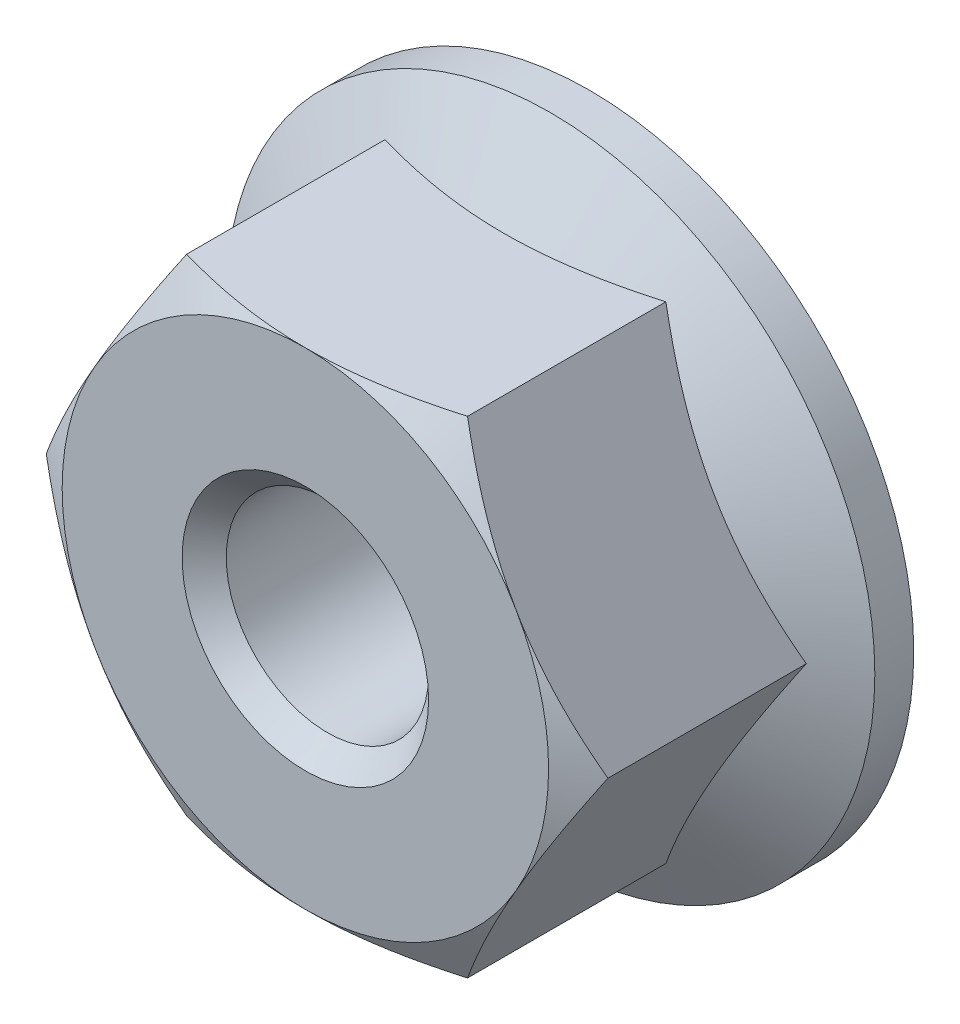
ISO-10303-21;
HEADER;
FILE_DESCRIPTION(('STEP AP214'),'2;1');
FILE_NAME('part.step','',(''),(''),'','','');
FILE_SCHEMA(('AUTOMOTIVE_DESIGN { 1 0 10303 214 1 1 1 1 }'));
ENDSEC;
DATA;
#1=APPLICATION_CONTEXT('core data for automotive mechanical design processes');
#2=APPLICATION_PROTOCOL_DEFINITION('international standard','automotive_design',2000,#1);
#3=PRODUCT_CONTEXT('',#1,'mechanical');
#4=PRODUCT('Part','Part','',(#3));
#5=PRODUCT_RELATED_PRODUCT_CATEGORY('part','',(#4));
#6=PRODUCT_DEFINITION_FORMATION('','',#4);
#7=PRODUCT_DEFINITION_CONTEXT('part definition',#1,'design');
#8=PRODUCT_DEFINITION('design','',#6,#7);
#9=PRODUCT_DEFINITION_SHAPE('','',#8);
#10=(LENGTH_UNIT() NAMED_UNIT(*) SI_UNIT(.MILLI.,.METRE.));
#11=(NAMED_UNIT(*) PLANE_ANGLE_UNIT() SI_UNIT($,.RADIAN.));
#12=(NAMED_UNIT(*) SI_UNIT($,.STERADIAN.) SOLID_ANGLE_UNIT());
#13=UNCERTAINTY_MEASURE_WITH_UNIT(LENGTH_MEASURE(1.E-05),#10,'distance_accuracy_value','');
#14=(GEOMETRIC_REPRESENTATION_CONTEXT(3) GLOBAL_UNCERTAINTY_ASSIGNED_CONTEXT((#13)) GLOBAL_UNIT_ASSIGNED_CONTEXT((#10,
#11,#12)) REPRESENTATION_CONTEXT('',''));
#15=CARTESIAN_POINT('',(0.,0.,0.));
#16=DIRECTION('',(0.,0.,1.));
#17=DIRECTION('',(1.,0.,0.));
#18=AXIS2_PLACEMENT_3D('',#15,#16,#17);
#19=CARTESIAN_POINT('',(0.,-4.7625,2.7813));
#20=DIRECTION('',(0.,-1.,0.));
#21=DIRECTION('',(0.,0.,-1.));
#22=AXIS2_PLACEMENT_3D('',#19,#20,#21);
#23=PLANE('',#22);
#24=CARTESIAN_POINT('',(-7.31277262481936,-4.7625,-3.39157957834396));
#25=CARTESIAN_POINT('',(-7.10531582893099,-4.7625,-3.29124059245172));
#26=CARTESIAN_POINT('',(-6.89737475905254,-4.7625,-3.19188530268858));
#27=CARTESIAN_POINT('',(-6.48026614732744,-4.7625,-2.9956970771459));
#28=CARTESIAN_POINT('',(-6.2710984113863,-4.7625,-2.89886455449802));
#29=CARTESIAN_POINT('',(-5.85016583326426,-4.7625,-2.70777413172438));
#30=CARTESIAN_POINT('',(-5.63839300109952,-4.7625,-2.61353376958497));
#31=CARTESIAN_POINT('',(-5.21313655356649,-4.7625,-2.42901032647706));
#32=CARTESIAN_POINT('',(-4.99965302198488,-4.7625,-2.33872705308252));
#33=CARTESIAN_POINT('',(-4.56413450975696,-4.7625,-2.16050502604635));
#34=CARTESIAN_POINT('',(-4.34203628404423,-4.7625,-2.07271996178041));
#35=CARTESIAN_POINT('',(-3.8952148687339,-4.7625,-1.90397249451181));
#36=CARTESIAN_POINT('',(-3.67049138415502,-4.7625,-1.82301086677019));
#37=CARTESIAN_POINT('',(-3.21850637128993,-4.7625,-1.6700886554335));
#38=CARTESIAN_POINT('',(-2.99125128598761,-4.7625,-1.59810922384759));
#39=CARTESIAN_POINT('',(-2.53348331918603,-4.7625,-1.46550862125786));
#40=CARTESIAN_POINT('',(-2.30297151134742,-4.7625,-1.4048837967434));
#41=CARTESIAN_POINT('',(-1.83977123973238,-4.7625,-1.29825421827041));
#42=CARTESIAN_POINT('',(-1.60709996304238,-4.7625,-1.25217619916643));
#43=CARTESIAN_POINT('',(-1.13894336043708,-4.7625,-1.17731394358896));
#44=CARTESIAN_POINT('',(-0.903458292344991,-4.7625,-1.14852813486418));
#45=CARTESIAN_POINT('',(-0.433895917843078,-4.7625,-1.11092464859668));
#46=CARTESIAN_POINT('',(-0.199839224603934,-4.7625,-1.10185588457093));
#47=CARTESIAN_POINT('',(0.268209903788481,-4.7625,-1.10379868103979));
#48=CARTESIAN_POINT('',(0.50220233617132,-4.7625,-1.11481100230956));
#49=CARTESIAN_POINT('',(0.901576446037724,-4.7625,-1.14997629227118));
#50=CARTESIAN_POINT('',(1.06739293001264,-4.7625,-1.16945593280516));
#51=CARTESIAN_POINT('',(1.3977570593784,-4.7625,-1.21724719963728));
#52=CARTESIAN_POINT('',(1.56230452055245,-4.7625,-1.24556008436734));
#53=CARTESIAN_POINT('',(2.05384900828579,-4.7625,-1.34225446506623));
#54=CARTESIAN_POINT('',(2.37855992859404,-4.7625,-1.42237297254334));
#55=CARTESIAN_POINT('',(2.86416277294439,-4.7625,-1.56063786001614));
#56=CARTESIAN_POINT('',(3.02758543613689,-4.7625,-1.61039570296239));
#57=CARTESIAN_POINT('',(3.35284127584869,-4.7625,-1.71490591154526));
#58=CARTESIAN_POINT('',(3.51467444109358,-4.7625,-1.76965831258032));
#59=CARTESIAN_POINT('',(3.83680793338163,-4.7625,-1.88329315759339));
#60=CARTESIAN_POINT('',(3.99710877149199,-4.7625,-1.94217416578946));
#61=CARTESIAN_POINT('',(4.31639195704726,-4.7625,-2.06339061062742));
#62=CARTESIAN_POINT('',(4.47537432686432,-4.7625,-2.12572598851615));
#63=CARTESIAN_POINT('',(4.87982542790888,-4.7625,-2.28856016756198));
#64=CARTESIAN_POINT('',(5.12447498170801,-4.7625,-2.39109101167478));
#65=CARTESIAN_POINT('',(5.61150193518266,-4.7625,-2.60143084772027));
#66=CARTESIAN_POINT('',(5.85387914871569,-4.7625,-2.7092402676319));
#67=CARTESIAN_POINT('',(6.33683778472449,-4.7625,-2.9289615365845));
#68=CARTESIAN_POINT('',(6.57741872199731,-4.7625,-3.04087444899536));
#69=CARTESIAN_POINT('',(7.05707209761573,-4.7625,-3.26789355440252));
#70=CARTESIAN_POINT('',(7.29614449869287,-4.7625,-3.38299982591472));
#71=CARTESIAN_POINT('',(7.77335299226614,-4.7625,-3.61589280946251));
#72=CARTESIAN_POINT('',(8.01148751462384,-4.7625,-3.73368273292286));
#73=CARTESIAN_POINT('',(8.48673374616877,-4.7625,-3.97131013651598));
#74=CARTESIAN_POINT('',(8.72384544592619,-4.7625,-4.09114763547581));
#75=CARTESIAN_POINT('',(9.43383532496106,-4.7625,-4.45309898133959));
#76=CARTESIAN_POINT('',(9.90544942554857,-4.7625,-4.69769162499889));
#77=CARTESIAN_POINT('',(10.8014870300508,-4.7625,-5.16787146353908));
#78=CARTESIAN_POINT('',(11.2261261924063,-4.7625,-5.39304952357623));
#79=CARTESIAN_POINT('',(12.0739620640069,-4.7625,-5.84615011554117));
#80=CARTESIAN_POINT('',(12.4971587058658,-4.7625,-6.07407277348603));
#81=CARTESIAN_POINT('',(13.3412622641046,-4.7625,-6.53133626304955));
#82=CARTESIAN_POINT('',(13.7621722752823,-4.7625,-6.76067139040718));
#83=CARTESIAN_POINT('',(14.6030866562808,-4.7625,-7.22093391801235));
#84=CARTESIAN_POINT('',(15.0230910815894,-4.7625,-7.45186121684072));
#85=CARTESIAN_POINT('',(15.4427707185534,-4.7625,-7.6833736207915));
#86=B_SPLINE_CURVE_WITH_KNOTS('',3,(#24,#25,#26,#27,#28,#29,#30,#31,#32,#33,#34,#35,#36,#37,#38,
#39,#40,#41,#42,#43,#44,#45,#46,#47,#48,#49,#50,#51,#52,#53,#54,#55,#56,#57,#58,#59,#60,#61,#62,
#63,#64,#65,#66,#67,#68,#69,#70,#71,#72,#73,#74,#75,#76,#77,#78,#79,#80,#81,#82,#83,#84,#85),
.UNSPECIFIED.,.F.,.F.,(4,2,2,2,2,2,2,2,2,2,2,2,2,2,2,2,2,2,2,2,2,2,2,2,2,2,2,2,2,2,4),(0.,
0.691352520490645,1.38281755504986,2.07817055041398,2.77348969442248,3.48985585032775,
4.20630328846759,4.92122112764056,5.63590853487241,6.34693676159138,7.05790033004569,
7.75975577635443,8.46163781312256,8.96226407925554,9.46296169991816,10.4649218035026,
10.9773699172163,11.4898216631367,12.0020960721858,12.5143617709593,13.3100702490217,
14.1058433491037,14.9018241420261,15.6978245232976,16.4948334655254,17.2918497400448,
18.8856109904745,20.3275478946742,21.7695512591814,23.2075457143335,24.6454494022123),.UNSPECIFIED.);
#87=CARTESIAN_POINT('',(2.7496306570156,-4.7625,-1.52812579064588));
#88=VERTEX_POINT('',#87);
#89=CARTESIAN_POINT('',(-2.74963065701559,-4.7625,-1.52812579064588));
#90=VERTEX_POINT('',#89);
#91=EDGE_CURVE('E33',#88,#90,#86,.F.);
#92=ORIENTED_EDGE('',*,*,#91,.F.);
#93=DIRECTION('',(0.,0.,-1.));
#94=VECTOR('',#93,1.);
#95=CARTESIAN_POINT('',(2.7496306570156,-4.7625,2.7813));
#96=LINE('',#95,#94);
#97=CARTESIAN_POINT('',(2.74963065701559,-4.7625,2.35593065701559));
#98=VERTEX_POINT('',#97);
#99=EDGE_CURVE('E301',#98,#88,#96,.T.);
#100=ORIENTED_EDGE('',*,*,#99,.F.);
#101=CARTESIAN_POINT('',(-7.29242571304483,-4.7625,0.502316565960371));
#102=CARTESIAN_POINT('',(-7.08332503258643,-4.7625,0.60336556539109));
#103=CARTESIAN_POINT('',(-6.87372996761938,-4.7625,0.703410053728296));
#104=CARTESIAN_POINT('',(-6.45328375890254,-4.7625,0.900915996958139));
#105=CARTESIAN_POINT('',(-6.24243240531597,-4.7625,0.998377004627258));
#106=CARTESIAN_POINT('',(-5.81806730761599,-4.7625,1.19065540519549));
#107=CARTESIAN_POINT('',(-5.60454523269943,-4.7625,1.28545447809146));
#108=CARTESIAN_POINT('',(-5.17574610716181,-4.7625,1.47098077077063));
#109=CARTESIAN_POINT('',(-4.96046914871242,-4.7625,1.56170820280082));
#110=CARTESIAN_POINT('',(-4.5251454275538,-4.7625,1.73908563549685));
#111=CARTESIAN_POINT('',(-4.30507255346546,-4.7625,1.82567190332287));
#112=CARTESIAN_POINT('',(-3.86233085885286,-4.7625,1.99206297392008));
#113=CARTESIAN_POINT('',(-3.6396617526365,-4.7625,2.07186702220485));
#114=CARTESIAN_POINT('',(-3.19183146915336,-4.7625,2.22254956266948));
#115=CARTESIAN_POINT('',(-2.96667674136295,-4.7625,2.29344703053589));
#116=CARTESIAN_POINT('',(-2.51316408606383,-4.7625,2.42401306484864));
#117=CARTESIAN_POINT('',(-2.28480719615868,-4.7625,2.4836851822739));
#118=CARTESIAN_POINT('',(-1.82474524250015,-4.7625,2.5889066642749));
#119=CARTESIAN_POINT('',(-1.59303930440612,-4.7625,2.63445226848496));
#120=CARTESIAN_POINT('',(-1.12680140245445,-4.7625,2.70834273327567));
#121=CARTESIAN_POINT('',(-0.892269436098446,-4.7625,2.7366875786487));
#122=CARTESIAN_POINT('',(-0.540098243423058,-4.7625,2.76448723017757));
#123=CARTESIAN_POINT('',(-0.423010288487475,-4.7625,2.77130225520439));
#124=CARTESIAN_POINT('',(-0.188645495023605,-4.7625,2.77997083260467));
#125=CARTESIAN_POINT('',(-0.0713686589679975,-4.7625,2.78182444940905));
#126=CARTESIAN_POINT('',(0.163123105354889,-4.7625,2.78052040467325));
#127=CARTESIAN_POINT('',(0.280338041752276,-4.7625,2.77736415799784));
#128=CARTESIAN_POINT('',(0.514533140154533,-4.7625,2.76612042625916));
#129=CARTESIAN_POINT('',(0.631513289308025,-4.7625,2.75803267827197));
#130=CARTESIAN_POINT('',(0.915050030184752,-4.7625,2.73262110809835));
#131=CARTESIAN_POINT('',(1.08138937418057,-4.7625,2.7128254688449));
#132=CARTESIAN_POINT('',(1.41276151801412,-4.7625,2.66436600239034));
#133=CARTESIAN_POINT('',(1.57779414061617,-4.7625,2.63570099263948));
#134=CARTESIAN_POINT('',(2.07083902042289,-4.7625,2.53791689937243));
#135=CARTESIAN_POINT('',(2.39654516294855,-4.7625,2.45703434554015));
#136=CARTESIAN_POINT('',(2.88391142522152,-4.7625,2.31753221869611));
#137=CARTESIAN_POINT('',(3.04811363656016,-4.7625,2.26729062409159));
#138=CARTESIAN_POINT('',(3.37480455011009,-4.7625,2.16183613562995));
#139=CARTESIAN_POINT('',(3.53729434901437,-4.7625,2.10662667064346));
#140=CARTESIAN_POINT('',(3.85988055284396,-4.7625,1.99238509962714));
#141=CARTESIAN_POINT('',(4.0199852814054,-4.7625,1.93337625913261));
#142=CARTESIAN_POINT('',(4.33895253974562,-4.7625,1.81189507990798));
#143=CARTESIAN_POINT('',(4.49781453744473,-4.7625,1.74942134134974));
#144=CARTESIAN_POINT('',(4.65610216606023,-4.7625,1.68555708908617));
#145=B_SPLINE_CURVE_WITH_KNOTS('',3,(#101,#102,#103,#104,#105,#106,#107,#108,#109,#110,#111,
#112,#113,#114,#115,#116,#117,#118,#119,#120,#121,#122,#123,#124,#125,#126,#127,#128,#129,#130,
#131,#132,#133,#134,#135,#136,#137,#138,#139,#140,#141,#142,#143,#144),.UNSPECIFIED.,.F.,.F.,(4,
2,2,2,2,2,2,2,2,2,2,2,2,2,2,2,2,2,2,2,2,4),(0.,0.696720165483733,1.39356016205725,
2.09438789250381,2.79517904757871,3.50457374312628,4.21404725210226,4.9219826078058,
5.62969364031719,6.33759289852652,7.04549278260686,7.39726182154394,7.74902629223846,
8.10069143675106,8.45237533199632,8.95462912158063,9.45694990534676,10.4623513294482,
10.9774608355396,11.4922174961111,12.0040767603637,12.5161443452106),.UNSPECIFIED.);
#146=CARTESIAN_POINT('',(0.,-4.7625,2.7813));
#147=VERTEX_POINT('',#146);
#148=EDGE_CURVE('E250',#98,#147,#145,.F.);
#149=ORIENTED_EDGE('',*,*,#148,.T.);
#150=CARTESIAN_POINT('',(-2.74963065701558,-4.7625,2.35593065701559));
#151=VERTEX_POINT('',#150);
#152=EDGE_CURVE('E243',#147,#151,#145,.F.);
#153=ORIENTED_EDGE('',*,*,#152,.T.);
#154=DIRECTION('',(0.,0.,-1.));
#155=VECTOR('',#154,1.);
#156=CARTESIAN_POINT('',(-2.74963065701559,-4.7625,2.7813));
#157=LINE('',#156,#155);
#158=EDGE_CURVE('E105',#151,#90,#157,.T.);
#159=ORIENTED_EDGE('',*,*,#158,.T.);
#160=EDGE_LOOP('',(#92,#100,#149,#153,#159));
#161=FACE_BOUND('',#160,.T.);
#162=ADVANCED_FACE('F17',(#161),#23,.T.);
#163=CARTESIAN_POINT('',(4.12444598552339,-2.38125,2.7813));
#164=DIRECTION('',(0.866025403784439,-0.5,0.));
#165=DIRECTION('',(0.5,0.866025403784439,0.));
#166=AXIS2_PLACEMENT_3D('',#163,#164,#165);
#167=PLANE('',#166);
#168=CARTESIAN_POINT('',(5.49937678408503,0.000200000000004337,-1.52819245941224));
#169=CARTESIAN_POINT('',(5.37853889601658,-0.209097361613872,-1.45841006007541));
#170=CARTESIAN_POINT('',(5.25666747870888,-0.420184848381223,-1.39493971227669));
#171=CARTESIAN_POINT('',(5.01081433128269,-0.846014990924109,-1.28415164373019));
#172=CARTESIAN_POINT('',(4.88682823299882,-1.060765212584,-1.23687311309126));
#173=CARTESIAN_POINT('',(4.64037371706653,-1.48763695593352,-1.16328997303025));
#174=CARTESIAN_POINT('',(4.51794368116041,-1.69969199849541,-1.13649523986319));
#175=CARTESIAN_POINT('',(4.33386795649885,-2.0185205060493,-1.11246756984234));
#176=CARTESIAN_POINT('',(4.27246738882597,-2.12486940887228,-1.10715108867078));
#177=CARTESIAN_POINT('',(4.1496095068933,-2.33766550248998,-1.10199661109317));
#178=CARTESIAN_POINT('',(4.08815219444489,-2.44411269014726,-1.10215844547067));
#179=CARTESIAN_POINT('',(3.91977561066751,-2.73574948805456,-1.11014139748338));
#180=CARTESIAN_POINT('',(3.81291212955969,-2.92084246680697,-1.12354886814936));
#181=CARTESIAN_POINT('',(3.59989441060936,-3.28979997894137,-1.16606431050516));
#182=CARTESIAN_POINT('',(3.49374092153974,-3.47366321541067,-1.19518681594157));
#183=CARTESIAN_POINT('',(3.28029401006835,-3.84336411079777,-1.26798570124837));
#184=CARTESIAN_POINT('',(3.17302752682367,-4.02915510972679,-1.31197056070812));
#185=CARTESIAN_POINT('',(2.96009430473234,-4.39796626900832,-1.41179872760029));
#186=CARTESIAN_POINT('',(2.85442483842812,-4.58099115345591,-1.46761858233952));
#187=CARTESIAN_POINT('',(2.74951518696175,-4.7627,-1.52819245941223));
#188=B_SPLINE_CURVE_WITH_KNOTS('',3,(#168,#169,#170,#171,#172,#173,#174,#175,#176,#177,#178,
#179,#180,#181,#182,#183,#184,#185,#186,#187),.UNSPECIFIED.,.F.,.F.,(4,2,2,2,2,2,2,2,2,4),(0.,
0.754910190012919,1.51163483480638,2.24963134670895,2.6182733624084,2.9869039913527,
3.6286742319225,4.27103902109237,4.92765153591997,5.58297484368456),.UNSPECIFIED.);
#189=CARTESIAN_POINT('',(5.49926131403119,0.,-1.52812579064588));
#190=VERTEX_POINT('',#189);
#191=EDGE_CURVE('E40',#190,#88,#188,.T.);
#192=ORIENTED_EDGE('',*,*,#191,.F.);
#193=DIRECTION('',(0.,0.,-1.));
#194=VECTOR('',#193,1.);
#195=CARTESIAN_POINT('',(5.49926131403119,0.,2.7813));
#196=LINE('',#195,#194);
#197=CARTESIAN_POINT('',(5.49926131403119,0.,2.35593065701559));
#198=VERTEX_POINT('',#197);
#199=EDGE_CURVE('E287',#198,#190,#196,.T.);
#200=ORIENTED_EDGE('',*,*,#199,.F.);
#201=CARTESIAN_POINT('',(5.49937678408503,0.000200000000004337,2.35586398824923));
#202=CARTESIAN_POINT('',(5.37853889601658,-0.209097361613873,2.42564638758605));
#203=CARTESIAN_POINT('',(5.25666747870888,-0.420184848381223,2.48911673538477));
#204=CARTESIAN_POINT('',(5.01081433128269,-0.84601499092411,2.59990480393127));
#205=CARTESIAN_POINT('',(4.88682823299882,-1.060765212584,2.6471833345702));
#206=CARTESIAN_POINT('',(4.64037371706653,-1.48763695593353,2.72076647463121));
#207=CARTESIAN_POINT('',(4.51794368116041,-1.69969199849541,2.74756120779827));
#208=CARTESIAN_POINT('',(4.33386795649885,-2.0185205060493,2.77158887781912));
#209=CARTESIAN_POINT('',(4.27246738882597,-2.12486940887228,2.77690535899069));
#210=CARTESIAN_POINT('',(4.1496095068933,-2.33766550248998,2.78205983656829));
#211=CARTESIAN_POINT('',(4.08815219444489,-2.44411269014726,2.78189800219079));
#212=CARTESIAN_POINT('',(3.91977561066751,-2.73574948805456,2.77391505017809));
#213=CARTESIAN_POINT('',(3.81291212955969,-2.92084246680697,2.76050757951211));
#214=CARTESIAN_POINT('',(3.59989441060936,-3.28979997894137,2.71799213715631));
#215=CARTESIAN_POINT('',(3.49374092153974,-3.47366321541067,2.6888696317199));
#216=CARTESIAN_POINT('',(3.28029401006835,-3.84336411079777,2.6160707464131));
#217=CARTESIAN_POINT('',(3.17302752682367,-4.02915510972679,2.57208588695335));
#218=CARTESIAN_POINT('',(2.96009430473234,-4.39796626900832,2.47225772006117));
#219=CARTESIAN_POINT('',(2.85442483842812,-4.58099115345591,2.41643786532194));
#220=CARTESIAN_POINT('',(2.74951518696175,-4.7627,2.35586398824924));
#221=B_SPLINE_CURVE_WITH_KNOTS('',3,(#201,#202,#203,#204,#205,#206,#207,#208,#209,#210,#211,
#212,#213,#214,#215,#216,#217,#218,#219,#220),.UNSPECIFIED.,.F.,.F.,(4,2,2,2,2,2,2,2,2,4),(0.,
0.754910190012918,1.51163483480638,2.24963134670895,2.6182733624084,2.9869039913527,
3.6286742319225,4.27103902109237,4.92765153591997,5.58297484368456),.UNSPECIFIED.);
#222=CARTESIAN_POINT('',(4.12444598552339,-2.38125,2.7813));
#223=VERTEX_POINT('',#222);
#224=EDGE_CURVE('E209',#198,#223,#221,.T.);
#225=ORIENTED_EDGE('',*,*,#224,.T.);
#226=EDGE_CURVE('E200',#223,#98,#221,.T.);
#227=ORIENTED_EDGE('',*,*,#226,.T.);
#228=ORIENTED_EDGE('',*,*,#99,.T.);
#229=EDGE_LOOP('',(#192,#200,#225,#227,#228));
#230=FACE_BOUND('',#229,.T.);
#231=ADVANCED_FACE('F192',(#230),#167,.T.);
#232=CARTESIAN_POINT('',(4.12444598552339,2.38125,2.7813));
#233=DIRECTION('',(0.866025403784438,0.5,0.));
#234=DIRECTION('',(-0.5,0.866025403784438,0.));
#235=AXIS2_PLACEMENT_3D('',#232,#233,#234);
#236=PLANE('',#235);
#237=CARTESIAN_POINT('',(2.74951518696175,4.7627,-1.52819245941223));
#238=CARTESIAN_POINT('',(2.8703530750302,4.55340263838612,-1.45841006007541));
#239=CARTESIAN_POINT('',(2.99222449233789,4.34231515161877,-1.39493971227669));
#240=CARTESIAN_POINT('',(3.23807763976409,3.91648500907589,-1.28415164373019));
#241=CARTESIAN_POINT('',(3.36206373804796,3.701734787416,-1.23687311309126));
#242=CARTESIAN_POINT('',(3.60851825398025,3.27486304406648,-1.16328997303025));
#243=CARTESIAN_POINT('',(3.73094828988637,3.06280800150459,-1.13649523986319));
#244=CARTESIAN_POINT('',(3.91502401454793,2.74397949395071,-1.11246756984234));
#245=CARTESIAN_POINT('',(3.9764245822208,2.63763059112772,-1.10715108867078));
#246=CARTESIAN_POINT('',(4.09928246415348,2.42483449751003,-1.10199661109317));
#247=CARTESIAN_POINT('',(4.1607397766019,2.31838730985274,-1.10215844547067));
#248=CARTESIAN_POINT('',(4.32911636037927,2.02675051194545,-1.11014139748338));
#249=CARTESIAN_POINT('',(4.43597984148708,1.84165753319304,-1.12354886814936));
#250=CARTESIAN_POINT('',(4.64899756043742,1.47270002105863,-1.16606431050516));
#251=CARTESIAN_POINT('',(4.75515104950704,1.28883678458934,-1.19518681594157));
#252=CARTESIAN_POINT('',(4.96859796097843,0.919135889202238,-1.26798570124836));
#253=CARTESIAN_POINT('',(5.07586444422311,0.733344890273218,-1.31197056070812));
#254=CARTESIAN_POINT('',(5.28879766631444,0.364533730991684,-1.41179872760029));
#255=CARTESIAN_POINT('',(5.39446713261865,0.181508846544097,-1.46761858233952));
#256=CARTESIAN_POINT('',(5.49937678408502,-0.000199999999994827,-1.52819245941223));
#257=B_SPLINE_CURVE_WITH_KNOTS('',3,(#237,#238,#239,#240,#241,#242,#243,#244,#245,#246,#247,
#248,#249,#250,#251,#252,#253,#254,#255,#256),.UNSPECIFIED.,.F.,.F.,(4,2,2,2,2,2,2,2,2,4),(0.,
0.754910190012917,1.51163483480638,2.24963134670895,2.61827336240839,2.9869039913527,
3.62867423192249,4.27103902109236,4.92765153591996,5.58297484368455),.UNSPECIFIED.);
#258=CARTESIAN_POINT('',(2.74963065701559,4.7625,-1.52812579064588));
#259=VERTEX_POINT('',#258);
#260=EDGE_CURVE('E173',#259,#190,#257,.T.);
#261=ORIENTED_EDGE('',*,*,#260,.F.);
#262=DIRECTION('',(0.,0.,-1.));
#263=VECTOR('',#262,1.);
#264=CARTESIAN_POINT('',(2.74963065701559,4.7625,2.7813));
#265=LINE('',#264,#263);
#266=CARTESIAN_POINT('',(2.7496306570156,4.7625,2.35593065701559));
#267=VERTEX_POINT('',#266);
#268=EDGE_CURVE('E303',#267,#259,#265,.T.);
#269=ORIENTED_EDGE('',*,*,#268,.F.);
#270=CARTESIAN_POINT('',(2.74951518696175,4.7627,2.35586398824923));
#271=CARTESIAN_POINT('',(2.8703530750302,4.55340263838612,2.42564638758605));
#272=CARTESIAN_POINT('',(2.99222449233789,4.34231515161877,2.48911673538477));
#273=CARTESIAN_POINT('',(3.23807763976409,3.91648500907589,2.59990480393128));
#274=CARTESIAN_POINT('',(3.36206373804796,3.701734787416,2.6471833345702));
#275=CARTESIAN_POINT('',(3.60851825398025,3.27486304406648,2.72076647463121));
#276=CARTESIAN_POINT('',(3.73094828988637,3.06280800150459,2.74756120779827));
#277=CARTESIAN_POINT('',(3.91502401454793,2.74397949395071,2.77158887781912));
#278=CARTESIAN_POINT('',(3.9764245822208,2.63763059112772,2.77690535899069));
#279=CARTESIAN_POINT('',(4.09928246415348,2.42483449751003,2.78205983656829));
#280=CARTESIAN_POINT('',(4.16073977660189,2.31838730985274,2.78189800219079));
#281=CARTESIAN_POINT('',(4.32911636037927,2.02675051194545,2.77391505017809));
#282=CARTESIAN_POINT('',(4.43597984148708,1.84165753319304,2.76050757951211));
#283=CARTESIAN_POINT('',(4.64899756043742,1.47270002105863,2.71799213715631));
#284=CARTESIAN_POINT('',(4.75515104950704,1.28883678458934,2.6888696317199));
#285=CARTESIAN_POINT('',(4.96859796097843,0.919135889202238,2.6160707464131));
#286=CARTESIAN_POINT('',(5.07586444422311,0.733344890273218,2.57208588695335));
#287=CARTESIAN_POINT('',(5.28879766631444,0.364533730991683,2.47225772006117));
#288=CARTESIAN_POINT('',(5.39446713261865,0.181508846544097,2.41643786532195));
#289=CARTESIAN_POINT('',(5.49937678408502,-0.000199999999995412,2.35586398824924));
#290=B_SPLINE_CURVE_WITH_KNOTS('',3,(#270,#271,#272,#273,#274,#275,#276,#277,#278,#279,#280,
#281,#282,#283,#284,#285,#286,#287,#288,#289),.UNSPECIFIED.,.F.,.F.,(4,2,2,2,2,2,2,2,2,4),(0.,
0.754910190012916,1.51163483480638,2.24963134670895,2.61827336240839,2.9869039913527,
3.62867423192249,4.27103902109236,4.92765153591996,5.58297484368455),.UNSPECIFIED.);
#291=CARTESIAN_POINT('',(4.12444598552339,2.38125,2.7813));
#292=VERTEX_POINT('',#291);
#293=EDGE_CURVE('E281',#267,#292,#290,.T.);
#294=ORIENTED_EDGE('',*,*,#293,.T.);
#295=EDGE_CURVE('E216',#292,#198,#290,.T.);
#296=ORIENTED_EDGE('',*,*,#295,.T.);
#297=ORIENTED_EDGE('',*,*,#199,.T.);
#298=EDGE_LOOP('',(#261,#269,#294,#296,#297));
#299=FACE_BOUND('',#298,.T.);
#300=ADVANCED_FACE('F195',(#299),#236,.T.);
#301=CARTESIAN_POINT('',(0.,4.7625,2.7813));
#302=DIRECTION('',(0.,1.,0.));
#303=DIRECTION('',(0.,0.,1.));
#304=AXIS2_PLACEMENT_3D('',#301,#302,#303);
#305=PLANE('',#304);
#306=CARTESIAN_POINT('',(-7.31277262481937,4.7625,-3.39157957834396));
#307=CARTESIAN_POINT('',(-7.105315828931,4.7625,-3.29124059245173));
#308=CARTESIAN_POINT('',(-6.89737475905255,4.7625,-3.19188530268858));
#309=CARTESIAN_POINT('',(-6.48026614732745,4.7625,-2.9956970771459));
#310=CARTESIAN_POINT('',(-6.2710984113863,4.7625,-2.89886455449802));
#311=CARTESIAN_POINT('',(-5.85016583326427,4.7625,-2.70777413172438));
#312=CARTESIAN_POINT('',(-5.63839300109953,4.7625,-2.61353376958497));
#313=CARTESIAN_POINT('',(-5.2131365535665,4.7625,-2.42901032647707));
#314=CARTESIAN_POINT('',(-4.99965302198489,4.7625,-2.33872705308253));
#315=CARTESIAN_POINT('',(-4.56413450975696,4.7625,-2.16050502604636));
#316=CARTESIAN_POINT('',(-4.34203628404424,4.7625,-2.07271996178042));
#317=CARTESIAN_POINT('',(-3.8952148687339,4.7625,-1.90397249451182));
#318=CARTESIAN_POINT('',(-3.67049138415502,4.7625,-1.82301086677019));
#319=CARTESIAN_POINT('',(-3.21850637128994,4.7625,-1.6700886554335));
#320=CARTESIAN_POINT('',(-2.99125128598762,4.7625,-1.59810922384759));
#321=CARTESIAN_POINT('',(-2.53348331918604,4.7625,-1.46550862125786));
#322=CARTESIAN_POINT('',(-2.30297151134743,4.7625,-1.4048837967434));
#323=CARTESIAN_POINT('',(-1.83977123973238,4.7625,-1.29825421827041));
#324=CARTESIAN_POINT('',(-1.60709996304239,4.7625,-1.25217619916643));
#325=CARTESIAN_POINT('',(-1.13894336043708,4.7625,-1.17731394358896));
#326=CARTESIAN_POINT('',(-0.903458292344996,4.7625,-1.14852813486418));
#327=CARTESIAN_POINT('',(-0.433895917843083,4.7625,-1.11092464859668));
#328=CARTESIAN_POINT('',(-0.199839224603939,4.7625,-1.10185588457093));
#329=CARTESIAN_POINT('',(0.268209903788476,4.7625,-1.10379868103979));
#330=CARTESIAN_POINT('',(0.502202336171316,4.7625,-1.11481100230956));
#331=CARTESIAN_POINT('',(0.90157644603772,4.7625,-1.14997629227118));
#332=CARTESIAN_POINT('',(1.06739293001264,4.7625,-1.16945593280516));
#333=CARTESIAN_POINT('',(1.3977570593784,4.7625,-1.21724719963728));
#334=CARTESIAN_POINT('',(1.56230452055245,4.7625,-1.24556008436734));
#335=CARTESIAN_POINT('',(2.05384900828578,4.7625,-1.34225446506623));
#336=CARTESIAN_POINT('',(2.37855992859404,4.7625,-1.42237297254334));
#337=CARTESIAN_POINT('',(2.86416277294439,4.7625,-1.56063786001614));
#338=CARTESIAN_POINT('',(3.02758543613689,4.7625,-1.61039570296239));
#339=CARTESIAN_POINT('',(3.35284127584869,4.7625,-1.71490591154526));
#340=CARTESIAN_POINT('',(3.51467444109358,4.7625,-1.76965831258032));
#341=CARTESIAN_POINT('',(3.83680793338163,4.7625,-1.88329315759339));
#342=CARTESIAN_POINT('',(3.99710877149199,4.7625,-1.94217416578946));
#343=CARTESIAN_POINT('',(4.31639195704726,4.7625,-2.06339061062742));
#344=CARTESIAN_POINT('',(4.47537432686432,4.7625,-2.12572598851615));
#345=CARTESIAN_POINT('',(4.87982542790888,4.7625,-2.28856016756198));
#346=CARTESIAN_POINT('',(5.12447498170801,4.7625,-2.39109101167478));
#347=CARTESIAN_POINT('',(5.61150193518265,4.7625,-2.60143084772027));
#348=CARTESIAN_POINT('',(5.85387914871569,4.7625,-2.7092402676319));
#349=CARTESIAN_POINT('',(6.33683778472448,4.7625,-2.9289615365845));
#350=CARTESIAN_POINT('',(6.57741872199731,4.7625,-3.04087444899535));
#351=CARTESIAN_POINT('',(7.05707209761573,4.7625,-3.26789355440251));
#352=CARTESIAN_POINT('',(7.29614449869286,4.7625,-3.38299982591471));
#353=CARTESIAN_POINT('',(7.77335299226613,4.7625,-3.61589280946251));
#354=CARTESIAN_POINT('',(8.01148751462383,4.7625,-3.73368273292286));
#355=CARTESIAN_POINT('',(8.48673374616875,4.7625,-3.97131013651598));
#356=CARTESIAN_POINT('',(8.72384544592618,4.7625,-4.09114763547581));
#357=CARTESIAN_POINT('',(9.43383532496104,4.7625,-4.45309898133959));
#358=CARTESIAN_POINT('',(9.90544942554855,4.7625,-4.69769162499888));
#359=CARTESIAN_POINT('',(10.8014870300507,4.7625,-5.16787146353907));
#360=CARTESIAN_POINT('',(11.2261261924063,4.7625,-5.39304952357622));
#361=CARTESIAN_POINT('',(12.0739620640069,4.7625,-5.84615011554115));
#362=CARTESIAN_POINT('',(12.4971587058658,4.7625,-6.07407277348602));
#363=CARTESIAN_POINT('',(13.3412622641046,4.7625,-6.53133626304953));
#364=CARTESIAN_POINT('',(13.7621722752823,4.7625,-6.76067139040716));
#365=CARTESIAN_POINT('',(14.6030866562808,4.7625,-7.22093391801234));
#366=CARTESIAN_POINT('',(15.0230910815893,4.7625,-7.45186121684071));
#367=CARTESIAN_POINT('',(15.4427707185534,4.7625,-7.6833736207915));
#368=B_SPLINE_CURVE_WITH_KNOTS('',3,(#306,#307,#308,#309,#310,#311,#312,#313,#314,#315,#316,
#317,#318,#319,#320,#321,#322,#323,#324,#325,#326,#327,#328,#329,#330,#331,#332,#333,#334,#335,
#336,#337,#338,#339,#340,#341,#342,#343,#344,#345,#346,#347,#348,#349,#350,#351,#352,#353,#354,
#355,#356,#357,#358,#359,#360,#361,#362,#363,#364,#365,#366,#367),.UNSPECIFIED.,.F.,.F.,(4,2,2,
2,2,2,2,2,2,2,2,2,2,2,2,2,2,2,2,2,2,2,2,2,2,2,2,2,2,2,4),(0.,0.691352520490646,1.38281755504986,
2.07817055041398,2.77348969442248,3.48985585032775,4.20630328846759,4.92122112764056,
5.63590853487242,6.34693676159138,7.0579003300457,7.75975577635443,8.46163781312256,
8.96226407925555,9.46296169991817,10.4649218035026,10.9773699172163,11.4898216631367,
12.0020960721858,12.5143617709593,13.3100702490218,14.1058433491037,14.9018241420261,
15.6978245232976,16.4948334655254,17.2918497400448,18.8856109904745,20.3275478946741,
21.7695512591814,23.2075457143334,24.6454494022123),.UNSPECIFIED.);
#369=CARTESIAN_POINT('',(-2.7496306570156,4.7625,-1.52812579064588));
#370=VERTEX_POINT('',#369);
#371=EDGE_CURVE('E116',#370,#259,#368,.T.);
#372=ORIENTED_EDGE('',*,*,#371,.F.);
#373=DIRECTION('',(0.,0.,-1.));
#374=VECTOR('',#373,1.);
#375=CARTESIAN_POINT('',(-2.7496306570156,4.7625,2.7813));
#376=LINE('',#375,#374);
#377=CARTESIAN_POINT('',(-2.74963065701559,4.7625,2.35593065701559));
#378=VERTEX_POINT('',#377);
#379=EDGE_CURVE('E104',#378,#370,#376,.T.);
#380=ORIENTED_EDGE('',*,*,#379,.F.);
#381=CARTESIAN_POINT('',(-7.29242571304484,4.7625,0.502316565960368));
#382=CARTESIAN_POINT('',(-7.08332503258644,4.7625,0.603365565391086));
#383=CARTESIAN_POINT('',(-6.87372996761939,4.7625,0.703410053728293));
#384=CARTESIAN_POINT('',(-6.45328375890254,4.7625,0.900915996958135));
#385=CARTESIAN_POINT('',(-6.24243240531598,4.7625,0.998377004627255));
#386=CARTESIAN_POINT('',(-5.818067307616,4.7625,1.19065540519549));
#387=CARTESIAN_POINT('',(-5.60454523269943,4.7625,1.28545447809146));
#388=CARTESIAN_POINT('',(-5.17574610716181,4.7625,1.47098077077062));
#389=CARTESIAN_POINT('',(-4.96046914871243,4.7625,1.56170820280082));
#390=CARTESIAN_POINT('',(-4.5251454275538,4.7625,1.73908563549685));
#391=CARTESIAN_POINT('',(-4.30507255346547,4.7625,1.82567190332286));
#392=CARTESIAN_POINT('',(-3.86233085885286,4.7625,1.99206297392008));
#393=CARTESIAN_POINT('',(-3.6396617526365,4.7625,2.07186702220485));
#394=CARTESIAN_POINT('',(-3.19183146915336,4.7625,2.22254956266948));
#395=CARTESIAN_POINT('',(-2.96667674136296,4.7625,2.29344703053589));
#396=CARTESIAN_POINT('',(-2.51316408606384,4.7625,2.42401306484863));
#397=CARTESIAN_POINT('',(-2.28480719615869,4.7625,2.48368518227389));
#398=CARTESIAN_POINT('',(-1.82474524250016,4.7625,2.58890666427489));
#399=CARTESIAN_POINT('',(-1.59303930440612,4.7625,2.63445226848496));
#400=CARTESIAN_POINT('',(-1.12680140245446,4.7625,2.70834273327567));
#401=CARTESIAN_POINT('',(-0.892269436098453,4.7625,2.7366875786487));
#402=CARTESIAN_POINT('',(-0.540098243423065,4.7625,2.76448723017757));
#403=CARTESIAN_POINT('',(-0.423010288487481,4.7625,2.77130225520439));
#404=CARTESIAN_POINT('',(-0.18864549502361,4.7625,2.77997083260467));
#405=CARTESIAN_POINT('',(-0.0713686589680028,4.7625,2.78182444940905));
#406=CARTESIAN_POINT('',(0.163123105354884,4.7625,2.78052040467325));
#407=CARTESIAN_POINT('',(0.280338041752272,4.7625,2.77736415799784));
#408=CARTESIAN_POINT('',(0.514533140154529,4.7625,2.76612042625916));
#409=CARTESIAN_POINT('',(0.631513289308021,4.7625,2.75803267827197));
#410=CARTESIAN_POINT('',(0.915050030184748,4.7625,2.73262110809835));
#411=CARTESIAN_POINT('',(1.08138937418057,4.7625,2.7128254688449));
#412=CARTESIAN_POINT('',(1.41276151801412,4.7625,2.66436600239034));
#413=CARTESIAN_POINT('',(1.57779414061616,4.7625,2.63570099263948));
#414=CARTESIAN_POINT('',(2.07083902042289,4.7625,2.53791689937243));
#415=CARTESIAN_POINT('',(2.39654516294855,4.7625,2.45703434554015));
#416=CARTESIAN_POINT('',(2.88391142522152,4.7625,2.31753221869611));
#417=CARTESIAN_POINT('',(3.04811363656015,4.7625,2.26729062409159));
#418=CARTESIAN_POINT('',(3.37480455011008,4.7625,2.16183613562995));
#419=CARTESIAN_POINT('',(3.53729434901436,4.7625,2.10662667064347));
#420=CARTESIAN_POINT('',(3.85988055284395,4.7625,1.99238509962714));
#421=CARTESIAN_POINT('',(4.0199852814054,4.7625,1.93337625913261));
#422=CARTESIAN_POINT('',(4.33895253974561,4.7625,1.81189507990799));
#423=CARTESIAN_POINT('',(4.49781453744472,4.7625,1.74942134134975));
#424=CARTESIAN_POINT('',(4.65610216606022,4.7625,1.68555708908617));
#425=B_SPLINE_CURVE_WITH_KNOTS('',3,(#381,#382,#383,#384,#385,#386,#387,#388,#389,#390,#391,
#392,#393,#394,#395,#396,#397,#398,#399,#400,#401,#402,#403,#404,#405,#406,#407,#408,#409,#410,
#411,#412,#413,#414,#415,#416,#417,#418,#419,#420,#421,#422,#423,#424),.UNSPECIFIED.,.F.,.F.,(4,
2,2,2,2,2,2,2,2,2,2,2,2,2,2,2,2,2,2,2,2,4),(0.,0.696720165483736,1.39356016205726,
2.09438789250382,2.79517904757872,3.50457374312629,4.21404725210227,4.9219826078058,
5.6296936403172,6.33759289852653,7.04549278260686,7.39726182154395,7.74902629223846,
8.10069143675107,8.45237533199633,8.95462912158064,9.45694990534677,10.4623513294482,
10.9774608355396,11.4922174961111,12.0040767603637,12.5161443452106),.UNSPECIFIED.);
#426=CARTESIAN_POINT('',(0.,4.7625,2.7813));
#427=VERTEX_POINT('',#426);
#428=EDGE_CURVE('E210',#378,#427,#425,.T.);
#429=ORIENTED_EDGE('',*,*,#428,.T.);
#430=EDGE_CURVE('E270',#427,#267,#425,.T.);
#431=ORIENTED_EDGE('',*,*,#430,.T.);
#432=ORIENTED_EDGE('',*,*,#268,.T.);
#433=EDGE_LOOP('',(#372,#380,#429,#431,#432));
#434=FACE_BOUND('',#433,.T.);
#435=ADVANCED_FACE('F339',(#434),#305,.T.);
#436=CARTESIAN_POINT('',(-4.12444598552339,2.38125,2.7813));
#437=DIRECTION('',(-0.866025403784439,0.5,0.));
#438=DIRECTION('',(-0.5,-0.866025403784439,0.));
#439=AXIS2_PLACEMENT_3D('',#436,#437,#438);
#440=PLANE('',#439);
#441=CARTESIAN_POINT('',(-5.49937678408503,-0.000200000000005204,-1.52819245941223));
#442=CARTESIAN_POINT('',(-5.37853889601658,0.209097361613872,-1.45841006007541));
#443=CARTESIAN_POINT('',(-5.25666747870888,0.420184848381223,-1.39493971227669));
#444=CARTESIAN_POINT('',(-5.01081433128269,0.846014990924109,-1.28415164373019));
#445=CARTESIAN_POINT('',(-4.88682823299882,1.060765212584,-1.23687311309126));
#446=CARTESIAN_POINT('',(-4.64037371706653,1.48763695593353,-1.16328997303025));
#447=CARTESIAN_POINT('',(-4.51794368116041,1.69969199849541,-1.13649523986319));
#448=CARTESIAN_POINT('',(-4.33386795649885,2.0185205060493,-1.11246756984234));
#449=CARTESIAN_POINT('',(-4.27246738882597,2.12486940887228,-1.10715108867078));
#450=CARTESIAN_POINT('',(-4.1496095068933,2.33766550248998,-1.10199661109317));
#451=CARTESIAN_POINT('',(-4.08815219444489,2.44411269014726,-1.10215844547067));
#452=CARTESIAN_POINT('',(-3.91977561066751,2.73574948805456,-1.11014139748338));
#453=CARTESIAN_POINT('',(-3.81291212955969,2.92084246680697,-1.12354886814936));
#454=CARTESIAN_POINT('',(-3.59989441060936,3.28979997894137,-1.16606431050516));
#455=CARTESIAN_POINT('',(-3.49374092153974,3.47366321541067,-1.19518681594157));
#456=CARTESIAN_POINT('',(-3.28029401006835,3.84336411079777,-1.26798570124837));
#457=CARTESIAN_POINT('',(-3.17302752682367,4.02915510972679,-1.31197056070812));
#458=CARTESIAN_POINT('',(-2.96009430473234,4.39796626900832,-1.41179872760029));
#459=CARTESIAN_POINT('',(-2.85442483842812,4.58099115345591,-1.46761858233952));
#460=CARTESIAN_POINT('',(-2.74951518696175,4.7627,-1.52819245941223));
#461=B_SPLINE_CURVE_WITH_KNOTS('',3,(#441,#442,#443,#444,#445,#446,#447,#448,#449,#450,#451,
#452,#453,#454,#455,#456,#457,#458,#459,#460),.UNSPECIFIED.,.F.,.F.,(4,2,2,2,2,2,2,2,2,4),(0.,
0.754910190012919,1.51163483480638,2.24963134670895,2.6182733624084,2.9869039913527,
3.6286742319225,4.27103902109237,4.92765153591997,5.58297484368456),.UNSPECIFIED.);
#462=CARTESIAN_POINT('',(-5.49926131403119,0.,-1.52812579064588));
#463=VERTEX_POINT('',#462);
#464=EDGE_CURVE('E109',#463,#370,#461,.T.);
#465=ORIENTED_EDGE('',*,*,#464,.F.);
#466=DIRECTION('',(0.,0.,-1.));
#467=VECTOR('',#466,1.);
#468=CARTESIAN_POINT('',(-5.49926131403119,0.,2.7813));
#469=LINE('',#468,#467);
#470=CARTESIAN_POINT('',(-5.49926131403119,0.,2.35593065701559));
#471=VERTEX_POINT('',#470);
#472=EDGE_CURVE('E92',#471,#463,#469,.T.);
#473=ORIENTED_EDGE('',*,*,#472,.F.);
#474=CARTESIAN_POINT('',(-5.49937678408503,-0.000200000000005204,2.35586398824923));
#475=CARTESIAN_POINT('',(-5.37853889601658,0.209097361613872,2.42564638758605));
#476=CARTESIAN_POINT('',(-5.25666747870889,0.420184848381222,2.48911673538477));
#477=CARTESIAN_POINT('',(-5.01081433128269,0.846014990924108,2.59990480393127));
#478=CARTESIAN_POINT('',(-4.88682823299882,1.060765212584,2.6471833345702));
#479=CARTESIAN_POINT('',(-4.64037371706653,1.48763695593352,2.72076647463121));
#480=CARTESIAN_POINT('',(-4.51794368116041,1.69969199849541,2.74756120779827));
#481=CARTESIAN_POINT('',(-4.33386795649885,2.01852050604929,2.77158887781912));
#482=CARTESIAN_POINT('',(-4.27246738882597,2.12486940887228,2.77690535899069));
#483=CARTESIAN_POINT('',(-4.1496095068933,2.33766550248997,2.78205983656829));
#484=CARTESIAN_POINT('',(-4.08815219444489,2.44411269014726,2.78189800219079));
#485=CARTESIAN_POINT('',(-3.91977561066751,2.73574948805455,2.77391505017809));
#486=CARTESIAN_POINT('',(-3.81291212955969,2.92084246680696,2.76050757951211));
#487=CARTESIAN_POINT('',(-3.59989441060936,3.28979997894137,2.71799213715631));
#488=CARTESIAN_POINT('',(-3.49374092153974,3.47366321541067,2.6888696317199));
#489=CARTESIAN_POINT('',(-3.28029401006835,3.84336411079776,2.6160707464131));
#490=CARTESIAN_POINT('',(-3.17302752682367,4.02915510972678,2.57208588695335));
#491=CARTESIAN_POINT('',(-2.96009430473234,4.39796626900832,2.47225772006117));
#492=CARTESIAN_POINT('',(-2.85442483842812,4.58099115345591,2.41643786532194));
#493=CARTESIAN_POINT('',(-2.74951518696175,4.7627,2.35586398824924));
#494=B_SPLINE_CURVE_WITH_KNOTS('',3,(#474,#475,#476,#477,#478,#479,#480,#481,#482,#483,#484,
#485,#486,#487,#488,#489,#490,#491,#492,#493),.UNSPECIFIED.,.F.,.F.,(4,2,2,2,2,2,2,2,2,4),(0.,
0.754910190012918,1.51163483480638,2.24963134670895,2.61827336240839,2.9869039913527,
3.6286742319225,4.27103902109237,4.92765153591997,5.58297484368456),.UNSPECIFIED.);
#495=CARTESIAN_POINT('',(-4.12444598552339,2.38125,2.7813));
#496=VERTEX_POINT('',#495);
#497=EDGE_CURVE('E237',#471,#496,#494,.T.);
#498=ORIENTED_EDGE('',*,*,#497,.T.);
#499=EDGE_CURVE('E255',#496,#378,#494,.T.);
#500=ORIENTED_EDGE('',*,*,#499,.T.);
#501=ORIENTED_EDGE('',*,*,#379,.T.);
#502=EDGE_LOOP('',(#465,#473,#498,#500,#501));
#503=FACE_BOUND('',#502,.T.);
#504=ADVANCED_FACE('F110',(#503),#440,.T.);
#505=CARTESIAN_POINT('',(-4.12444598552339,-2.38125,2.7813));
#506=DIRECTION('',(-0.866025403784438,-0.5,0.));
#507=DIRECTION('',(0.5,-0.866025403784438,0.));
#508=AXIS2_PLACEMENT_3D('',#505,#506,#507);
#509=PLANE('',#508);
#510=CARTESIAN_POINT('',(-2.74951518696175,-4.7627,-1.52819245941223));
#511=CARTESIAN_POINT('',(-2.87035307503021,-4.55340263838612,-1.45841006007541));
#512=CARTESIAN_POINT('',(-2.9922244923379,-4.34231515161877,-1.39493971227669));
#513=CARTESIAN_POINT('',(-3.23807763976409,-3.91648500907589,-1.28415164373019));
#514=CARTESIAN_POINT('',(-3.36206373804796,-3.701734787416,-1.23687311309126));
#515=CARTESIAN_POINT('',(-3.60851825398025,-3.27486304406647,-1.16328997303025));
#516=CARTESIAN_POINT('',(-3.73094828988638,-3.06280800150458,-1.13649523986319));
#517=CARTESIAN_POINT('',(-3.91502401454794,-2.7439794939507,-1.11246756984234));
#518=CARTESIAN_POINT('',(-3.97642458222081,-2.63763059112771,-1.10715108867078));
#519=CARTESIAN_POINT('',(-4.09928246415348,-2.42483449751002,-1.10199661109317));
#520=CARTESIAN_POINT('',(-4.1607397766019,-2.31838730985273,-1.10215844547067));
#521=CARTESIAN_POINT('',(-4.32911636037927,-2.02675051194544,-1.11014139748338));
#522=CARTESIAN_POINT('',(-4.43597984148709,-1.84165753319303,-1.12354886814936));
#523=CARTESIAN_POINT('',(-4.64899756043742,-1.47270002105863,-1.16606431050516));
#524=CARTESIAN_POINT('',(-4.75515104950704,-1.28883678458933,-1.19518681594157));
#525=CARTESIAN_POINT('',(-4.96859796097843,-0.919135889202235,-1.26798570124836));
#526=CARTESIAN_POINT('',(-5.07586444422311,-0.733344890273216,-1.31197056070812));
#527=CARTESIAN_POINT('',(-5.28879766631444,-0.364533730991684,-1.41179872760029));
#528=CARTESIAN_POINT('',(-5.39446713261865,-0.181508846544097,-1.46761858233952));
#529=CARTESIAN_POINT('',(-5.49937678408502,0.000199999999993873,-1.52819245941223));
#530=B_SPLINE_CURVE_WITH_KNOTS('',3,(#510,#511,#512,#513,#514,#515,#516,#517,#518,#519,#520,
#521,#522,#523,#524,#525,#526,#527,#528,#529),.UNSPECIFIED.,.F.,.F.,(4,2,2,2,2,2,2,2,2,4),(0.,
0.754910190012918,1.51163483480638,2.24963134670895,2.61827336240839,2.9869039913527,
3.6286742319225,4.27103902109236,4.92765153591996,5.58297484368454),.UNSPECIFIED.);
#531=EDGE_CURVE('E97',#90,#463,#530,.T.);
#532=ORIENTED_EDGE('',*,*,#531,.F.);
#533=ORIENTED_EDGE('',*,*,#158,.F.);
#534=CARTESIAN_POINT('',(-2.74951518696175,-4.7627,2.35586398824924));
#535=CARTESIAN_POINT('',(-2.87035307503021,-4.55340263838612,2.42564638758606));
#536=CARTESIAN_POINT('',(-2.9922244923379,-4.34231515161877,2.48911673538478));
#537=CARTESIAN_POINT('',(-3.23807763976409,-3.91648500907589,2.59990480393128));
#538=CARTESIAN_POINT('',(-3.36206373804796,-3.701734787416,2.6471833345702));
#539=CARTESIAN_POINT('',(-3.60851825398025,-3.27486304406647,2.72076647463121));
#540=CARTESIAN_POINT('',(-3.73094828988637,-3.06280800150459,2.74756120779827));
#541=CARTESIAN_POINT('',(-3.91502401454793,-2.7439794939507,2.77158887781912));
#542=CARTESIAN_POINT('',(-3.97642458222081,-2.63763059112772,2.77690535899069));
#543=CARTESIAN_POINT('',(-4.09928246415348,-2.42483449751002,2.78205983656829));
#544=CARTESIAN_POINT('',(-4.1607397766019,-2.31838730985274,2.78189800219079));
#545=CARTESIAN_POINT('',(-4.32911636037927,-2.02675051194544,2.77391505017809));
#546=CARTESIAN_POINT('',(-4.43597984148709,-1.84165753319303,2.76050757951211));
#547=CARTESIAN_POINT('',(-4.64899756043742,-1.47270002105863,2.71799213715631));
#548=CARTESIAN_POINT('',(-4.75515104950704,-1.28883678458934,2.6888696317199));
#549=CARTESIAN_POINT('',(-4.96859796097843,-0.919135889202237,2.6160707464131));
#550=CARTESIAN_POINT('',(-5.07586444422311,-0.733344890273217,2.57208588695335));
#551=CARTESIAN_POINT('',(-5.28879766631444,-0.364533730991684,2.47225772006117));
#552=CARTESIAN_POINT('',(-5.39446713261865,-0.181508846544097,2.41643786532195));
#553=CARTESIAN_POINT('',(-5.49937678408502,0.000199999999995226,2.35586398824924));
#554=B_SPLINE_CURVE_WITH_KNOTS('',3,(#534,#535,#536,#537,#538,#539,#540,#541,#542,#543,#544,
#545,#546,#547,#548,#549,#550,#551,#552,#553),.UNSPECIFIED.,.F.,.F.,(4,2,2,2,2,2,2,2,2,4),(0.,
0.754910190012917,1.51163483480638,2.24963134670895,2.61827336240839,2.9869039913527,
3.62867423192249,4.27103902109236,4.92765153591996,5.58297484368454),.UNSPECIFIED.);
#555=CARTESIAN_POINT('',(-4.12444598552339,-2.38125,2.7813));
#556=VERTEX_POINT('',#555);
#557=EDGE_CURVE('E123',#151,#556,#554,.T.);
#558=ORIENTED_EDGE('',*,*,#557,.T.);
#559=EDGE_CURVE('E100',#556,#471,#554,.T.);
#560=ORIENTED_EDGE('',*,*,#559,.T.);
#561=ORIENTED_EDGE('',*,*,#472,.T.);
#562=EDGE_LOOP('',(#532,#533,#558,#560,#561));
#563=FACE_BOUND('',#562,.T.);
#564=ADVANCED_FACE('F94',(#563),#509,.T.);
#565=CARTESIAN_POINT('',(0.,0.,2.7813));
#566=DIRECTION('',(0.,0.,1.));
#567=DIRECTION('',(1.,0.,0.));
#568=AXIS2_PLACEMENT_3D('',#565,#566,#567);
#569=PLANE('',#568);
#570=CARTESIAN_POINT('',(0.,0.,2.7813));
#571=DIRECTION('',(0.,0.,1.));
#572=DIRECTION('',(1.,0.,0.));
#573=AXIS2_PLACEMENT_3D('',#570,#571,#572);
#574=CIRCLE('',#573,2.413);
#575=CARTESIAN_POINT('',(2.413,0.,2.7813));
#576=VERTEX_POINT('',#575);
#577=EDGE_CURVE('E11',#576,#576,#574,.F.);
#578=ORIENTED_EDGE('',*,*,#577,.T.);
#579=EDGE_LOOP('',(#578));
#580=FACE_BOUND('',#579,.T.);
#581=CARTESIAN_POINT('',(0.,0.,2.7813));
#582=DIRECTION('',(0.,0.,1.));
#583=DIRECTION('',(1.,0.,0.));
#584=AXIS2_PLACEMENT_3D('',#581,#582,#583);
#585=CIRCLE('',#584,4.7625);
#586=EDGE_CURVE('E264',#223,#292,#585,.T.);
#587=ORIENTED_EDGE('',*,*,#586,.T.);
#588=EDGE_CURVE('E257',#292,#427,#585,.T.);
#589=ORIENTED_EDGE('',*,*,#588,.T.);
#590=EDGE_CURVE('E263',#427,#496,#585,.T.);
#591=ORIENTED_EDGE('',*,*,#590,.T.);
#592=EDGE_CURVE('E299',#496,#556,#585,.T.);
#593=ORIENTED_EDGE('',*,*,#592,.T.);
#594=EDGE_CURVE('E295',#556,#147,#585,.T.);
#595=ORIENTED_EDGE('',*,*,#594,.T.);
#596=EDGE_CURVE('E293',#147,#223,#585,.T.);
#597=ORIENTED_EDGE('',*,*,#596,.T.);
#598=EDGE_LOOP('',(#587,#589,#591,#593,#595,#597));
#599=FACE_BOUND('',#598,.T.);
#600=ADVANCED_FACE('F230',(#580,#599),#569,.T.);
#601=CARTESIAN_POINT('',(0.,0.,2.7813));
#602=DIRECTION('',(0.,0.,-1.));
#603=DIRECTION('',(-1.,0.,0.));
#604=AXIS2_PLACEMENT_3D('',#601,#602,#603);
#605=CYLINDRICAL_SURFACE('',#604,1.9812);
#606=CARTESIAN_POINT('',(0.,0.,-2.3495));
#607=DIRECTION('',(0.,0.,1.));
#608=DIRECTION('',(1.,0.,0.));
#609=AXIS2_PLACEMENT_3D('',#606,#607,#608);
#610=CIRCLE('',#609,1.9812);
#611=CARTESIAN_POINT('',(1.9812,0.,-2.3495));
#612=VERTEX_POINT('',#611);
#613=EDGE_CURVE('E26',#612,#612,#610,.F.);
#614=ORIENTED_EDGE('',*,*,#613,.T.);
#615=EDGE_LOOP('',(#614));
#616=FACE_BOUND('',#615,.T.);
#617=CARTESIAN_POINT('',(0.,0.,2.3495));
#618=DIRECTION('',(0.,0.,1.));
#619=DIRECTION('',(1.,0.,0.));
#620=AXIS2_PLACEMENT_3D('',#617,#618,#619);
#621=CIRCLE('',#620,1.9812);
#622=CARTESIAN_POINT('',(1.9812,0.,2.3495));
#623=VERTEX_POINT('',#622);
#624=EDGE_CURVE('E130',#623,#623,#621,.T.);
#625=ORIENTED_EDGE('',*,*,#624,.T.);
#626=EDGE_LOOP('',(#625));
#627=FACE_BOUND('',#626,.T.);
#628=ADVANCED_FACE('F356',(#616,#627),#605,.F.);
#629=CARTESIAN_POINT('',(0.,0.,-2.7813));
#630=DIRECTION('',(0.,0.,1.));
#631=DIRECTION('',(1.,0.,0.));
#632=AXIS2_PLACEMENT_3D('',#629,#630,#631);
#633=PLANE('',#632);
#634=CARTESIAN_POINT('',(0.,0.,-2.7813));
#635=DIRECTION('',(0.,0.,1.));
#636=DIRECTION('',(1.,0.,0.));
#637=AXIS2_PLACEMENT_3D('',#634,#635,#636);
#638=CIRCLE('',#637,2.413);
#639=CARTESIAN_POINT('',(2.413,0.,-2.7813));
#640=VERTEX_POINT('',#639);
#641=EDGE_CURVE('E122',#640,#640,#638,.T.);
#642=ORIENTED_EDGE('',*,*,#641,.T.);
#643=EDGE_LOOP('',(#642));
#644=FACE_BOUND('',#643,.T.);
#645=CARTESIAN_POINT('',(0.,0.,-2.7813));
#646=DIRECTION('',(0.,0.,1.));
#647=DIRECTION('',(1.,0.,0.));
#648=AXIS2_PLACEMENT_3D('',#645,#646,#647);
#649=CIRCLE('',#648,6.35);
#650=CARTESIAN_POINT('',(6.35,0.,-2.7813));
#651=VERTEX_POINT('',#650);
#652=EDGE_CURVE('E117',#651,#651,#649,.T.);
#653=ORIENTED_EDGE('',*,*,#652,.F.);
#654=EDGE_LOOP('',(#653));
#655=FACE_BOUND('',#654,.T.);
#656=ADVANCED_FACE('F227',(#644,#655),#633,.F.);
#657=CARTESIAN_POINT('',(0.,0.,2.7813));
#658=DIRECTION('',(0.,0.,-1.));
#659=DIRECTION('',(-1.,0.,0.));
#660=AXIS2_PLACEMENT_3D('',#657,#658,#659);
#661=CONICAL_SURFACE('',#660,4.7625,1.0471975511966);
#662=ORIENTED_EDGE('',*,*,#559,.F.);
#663=ORIENTED_EDGE('',*,*,#592,.F.);
#664=ORIENTED_EDGE('',*,*,#497,.F.);
#665=EDGE_LOOP('',(#662,#663,#664));
#666=FACE_BOUND('',#665,.T.);
#667=ADVANCED_FACE('F222',(#666),#661,.T.);
#668=ORIENTED_EDGE('',*,*,#594,.F.);
#669=ORIENTED_EDGE('',*,*,#557,.F.);
#670=ORIENTED_EDGE('',*,*,#152,.F.);
#671=EDGE_LOOP('',(#668,#669,#670));
#672=FACE_BOUND('',#671,.T.);
#673=ADVANCED_FACE('F226',(#672),#661,.T.);
#674=ORIENTED_EDGE('',*,*,#499,.F.);
#675=ORIENTED_EDGE('',*,*,#590,.F.);
#676=ORIENTED_EDGE('',*,*,#428,.F.);
#677=EDGE_LOOP('',(#674,#675,#676));
#678=FACE_BOUND('',#677,.T.);
#679=ADVANCED_FACE('F317',(#678),#661,.T.);
#680=ORIENTED_EDGE('',*,*,#430,.F.);
#681=ORIENTED_EDGE('',*,*,#588,.F.);
#682=ORIENTED_EDGE('',*,*,#293,.F.);
#683=EDGE_LOOP('',(#680,#681,#682));
#684=FACE_BOUND('',#683,.T.);
#685=ADVANCED_FACE('F229',(#684),#661,.T.);
#686=ORIENTED_EDGE('',*,*,#586,.F.);
#687=ORIENTED_EDGE('',*,*,#224,.F.);
#688=ORIENTED_EDGE('',*,*,#295,.F.);
#689=EDGE_LOOP('',(#686,#687,#688));
#690=FACE_BOUND('',#689,.T.);
#691=ADVANCED_FACE('F312',(#690),#661,.T.);
#692=ORIENTED_EDGE('',*,*,#596,.F.);
#693=ORIENTED_EDGE('',*,*,#148,.F.);
#694=ORIENTED_EDGE('',*,*,#226,.F.);
#695=EDGE_LOOP('',(#692,#693,#694));
#696=FACE_BOUND('',#695,.T.);
#697=ADVANCED_FACE('F319',(#696),#661,.T.);
#698=CARTESIAN_POINT('',(0.,0.,-4.76836832240224));
#699=DIRECTION('',(0.,0.,1.));
#700=DIRECTION('',(1.,0.,0.));
#701=AXIS2_PLACEMENT_3D('',#698,#699,#700);
#702=CYLINDRICAL_SURFACE('',#701,6.35);
#703=ORIENTED_EDGE('',*,*,#652,.T.);
#704=EDGE_LOOP('',(#703));
#705=FACE_BOUND('',#704,.T.);
#706=CARTESIAN_POINT('',(0.,0.,-2.0193));
#707=DIRECTION('',(0.,0.,1.));
#708=DIRECTION('',(1.,0.,0.));
#709=AXIS2_PLACEMENT_3D('',#706,#707,#708);
#710=CIRCLE('',#709,6.35);
#711=CARTESIAN_POINT('',(6.35,0.,-2.0193));
#712=VERTEX_POINT('',#711);
#713=EDGE_CURVE('E443',#712,#712,#710,.T.);
#714=ORIENTED_EDGE('',*,*,#713,.F.);
#715=EDGE_LOOP('',(#714));
#716=FACE_BOUND('',#715,.T.);
#717=ADVANCED_FACE('F154',(#705,#716),#702,.T.);
#718=CARTESIAN_POINT('',(0.,0.,0.503027856035641));
#719=DIRECTION('',(0.,0.,-1.));
#720=DIRECTION('',(-1.,0.,0.));
#721=AXIS2_PLACEMENT_3D('',#718,#719,#720);
#722=CONICAL_SURFACE('',#721,1.9812,1.0471975511966);
#723=ORIENTED_EDGE('',*,*,#191,.T.);
#724=ORIENTED_EDGE('',*,*,#91,.T.);
#725=ORIENTED_EDGE('',*,*,#531,.T.);
#726=ORIENTED_EDGE('',*,*,#464,.T.);
#727=ORIENTED_EDGE('',*,*,#371,.T.);
#728=ORIENTED_EDGE('',*,*,#260,.T.);
#729=EDGE_LOOP('',(#723,#724,#725,#726,#727,#728));
#730=FACE_BOUND('',#729,.T.);
#731=ORIENTED_EDGE('',*,*,#713,.T.);
#732=EDGE_LOOP('',(#731));
#733=FACE_BOUND('',#732,.T.);
#734=ADVANCED_FACE('F119',(#730,#733),#722,.T.);
#735=CARTESIAN_POINT('',(0.,0.,-2.7813));
#736=DIRECTION('',(0.,0.,-1.));
#737=DIRECTION('',(-1.,0.,0.));
#738=AXIS2_PLACEMENT_3D('',#735,#736,#737);
#739=CONICAL_SURFACE('',#738,2.413,0.785398163397448);
#740=ORIENTED_EDGE('',*,*,#613,.F.);
#741=EDGE_LOOP('',(#740));
#742=FACE_BOUND('',#741,.T.);
#743=ORIENTED_EDGE('',*,*,#641,.F.);
#744=EDGE_LOOP('',(#743));
#745=FACE_BOUND('',#744,.T.);
#746=ADVANCED_FACE('F153',(#742,#745),#739,.F.);
#747=CARTESIAN_POINT('',(0.,0.,2.3495));
#748=DIRECTION('',(0.,0.,1.));
#749=DIRECTION('',(1.,0.,0.));
#750=AXIS2_PLACEMENT_3D('',#747,#748,#749);
#751=CONICAL_SURFACE('',#750,1.9812,0.785398163397448);
#752=ORIENTED_EDGE('',*,*,#577,.F.);
#753=EDGE_LOOP('',(#752));
#754=FACE_BOUND('',#753,.T.);
#755=ORIENTED_EDGE('',*,*,#624,.F.);
#756=EDGE_LOOP('',(#755));
#757=FACE_BOUND('',#756,.T.);
#758=ADVANCED_FACE('F19',(#754,#757),#751,.F.);
#759=CLOSED_SHELL('',(#162,#231,#300,#435,#504,#564,#600,#628,#656,#667,#673,#679,#685,#691,
#697,#717,#734,#746,#758));
#760=MANIFOLD_SOLID_BREP('B1',#759);
#761=ADVANCED_BREP_SHAPE_REPRESENTATION('',(#18,#760),#14);
#762=SHAPE_DEFINITION_REPRESENTATION(#9,#761);
ENDSEC;
END-ISO-10303-21;
